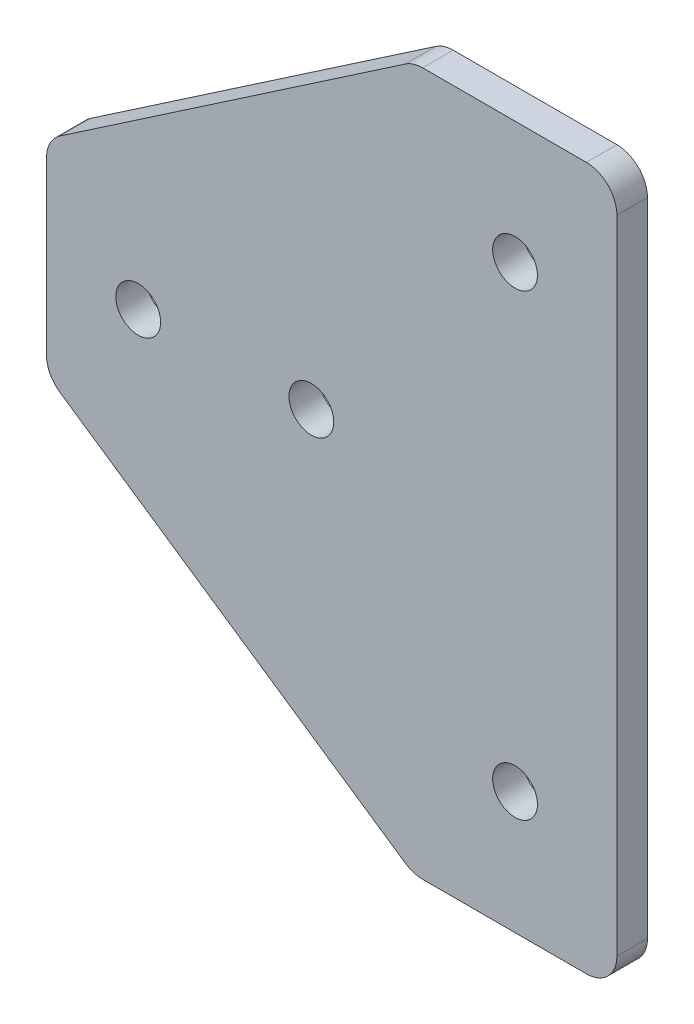
ISO-10303-21;
HEADER;
FILE_DESCRIPTION(('STEP AP214'),'2;1');
FILE_NAME('part.step','',(''),(''),'','','');
FILE_SCHEMA(('AUTOMOTIVE_DESIGN { 1 0 10303 214 1 1 1 1 }'));
ENDSEC;
DATA;
#1=APPLICATION_CONTEXT('core data for automotive mechanical design processes');
#2=APPLICATION_PROTOCOL_DEFINITION('international standard','automotive_design',2000,#1);
#3=PRODUCT_CONTEXT('',#1,'mechanical');
#4=PRODUCT('Part','Part','',(#3));
#5=PRODUCT_RELATED_PRODUCT_CATEGORY('part','',(#4));
#6=PRODUCT_DEFINITION_FORMATION('','',#4);
#7=PRODUCT_DEFINITION_CONTEXT('part definition',#1,'design');
#8=PRODUCT_DEFINITION('design','',#6,#7);
#9=PRODUCT_DEFINITION_SHAPE('','',#8);
#10=(LENGTH_UNIT() NAMED_UNIT(*) SI_UNIT(.MILLI.,.METRE.));
#11=(NAMED_UNIT(*) PLANE_ANGLE_UNIT() SI_UNIT($,.RADIAN.));
#12=(NAMED_UNIT(*) SI_UNIT($,.STERADIAN.) SOLID_ANGLE_UNIT());
#13=UNCERTAINTY_MEASURE_WITH_UNIT(LENGTH_MEASURE(1.E-05),#10,'distance_accuracy_value','');
#14=(GEOMETRIC_REPRESENTATION_CONTEXT(3) GLOBAL_UNCERTAINTY_ASSIGNED_CONTEXT((#13)) GLOBAL_UNIT_ASSIGNED_CONTEXT((#10,
#11,#12)) REPRESENTATION_CONTEXT('',''));
#15=CARTESIAN_POINT('',(0.,0.,0.));
#16=DIRECTION('',(0.,0.,1.));
#17=DIRECTION('',(1.,0.,0.));
#18=AXIS2_PLACEMENT_3D('',#15,#16,#17);
#19=CARTESIAN_POINT('',(-20.,-34.5,3.));
#20=DIRECTION('',(0.,1.,0.));
#21=DIRECTION('',(0.,0.,1.));
#22=AXIS2_PLACEMENT_3D('',#19,#20,#21);
#23=PLANE('',#22);
#24=DIRECTION('',(1.,0.,0.));
#25=VECTOR('',#24,1.);
#26=CARTESIAN_POINT('',(-20.,-34.5,0.));
#27=LINE('',#26,#25);
#28=CARTESIAN_POINT('',(-19.076005786987,-34.5,0.));
#29=VERTEX_POINT('',#28);
#30=CARTESIAN_POINT('',(-3.,-34.5,0.));
#31=VERTEX_POINT('',#30);
#32=EDGE_CURVE('E149',#29,#31,#27,.T.);
#33=ORIENTED_EDGE('',*,*,#32,.T.);
#34=DIRECTION('',(0.,0.,-1.));
#35=VECTOR('',#34,1.);
#36=CARTESIAN_POINT('',(-3.,-34.5,3.));
#37=LINE('',#36,#35);
#38=CARTESIAN_POINT('',(-3.,-34.5,3.));
#39=VERTEX_POINT('',#38);
#40=EDGE_CURVE('E127',#31,#39,#37,.F.);
#41=ORIENTED_EDGE('',*,*,#40,.T.);
#42=DIRECTION('',(1.,0.,0.));
#43=VECTOR('',#42,1.);
#44=CARTESIAN_POINT('',(-20.,-34.5,3.));
#45=LINE('',#44,#43);
#46=CARTESIAN_POINT('',(-19.076005786987,-34.5,3.));
#47=VERTEX_POINT('',#46);
#48=EDGE_CURVE('E165',#47,#39,#45,.T.);
#49=ORIENTED_EDGE('',*,*,#48,.F.);
#50=DIRECTION('',(0.,0.,-1.));
#51=VECTOR('',#50,1.);
#52=CARTESIAN_POINT('',(-19.076005786987,-34.5,3.));
#53=LINE('',#52,#51);
#54=EDGE_CURVE('E132',#47,#29,#53,.T.);
#55=ORIENTED_EDGE('',*,*,#54,.T.);
#56=EDGE_LOOP('',(#33,#41,#49,#55));
#57=FACE_BOUND('',#56,.T.);
#58=ADVANCED_FACE('F32',(#57),#23,.F.);
#59=CARTESIAN_POINT('',(0.,-34.5,3.));
#60=DIRECTION('',(-1.,0.,0.));
#61=DIRECTION('',(0.,0.,1.));
#62=AXIS2_PLACEMENT_3D('',#59,#60,#61);
#63=PLANE('',#62);
#64=DIRECTION('',(0.,1.,0.));
#65=VECTOR('',#64,1.);
#66=CARTESIAN_POINT('',(0.,-34.5,3.));
#67=LINE('',#66,#65);
#68=CARTESIAN_POINT('',(0.,-31.5,3.));
#69=VERTEX_POINT('',#68);
#70=CARTESIAN_POINT('',(0.,31.5,3.));
#71=VERTEX_POINT('',#70);
#72=EDGE_CURVE('E142',#69,#71,#67,.T.);
#73=ORIENTED_EDGE('',*,*,#72,.F.);
#74=DIRECTION('',(0.,0.,-1.));
#75=VECTOR('',#74,1.);
#76=CARTESIAN_POINT('',(0.,-31.5,3.));
#77=LINE('',#76,#75);
#78=CARTESIAN_POINT('',(0.,-31.5,0.));
#79=VERTEX_POINT('',#78);
#80=EDGE_CURVE('E126',#69,#79,#77,.T.);
#81=ORIENTED_EDGE('',*,*,#80,.T.);
#82=DIRECTION('',(0.,1.,0.));
#83=VECTOR('',#82,1.);
#84=CARTESIAN_POINT('',(0.,-34.5,0.));
#85=LINE('',#84,#83);
#86=CARTESIAN_POINT('',(0.,31.5,0.));
#87=VERTEX_POINT('',#86);
#88=EDGE_CURVE('E139',#79,#87,#85,.T.);
#89=ORIENTED_EDGE('',*,*,#88,.T.);
#90=DIRECTION('',(0.,0.,-1.));
#91=VECTOR('',#90,1.);
#92=CARTESIAN_POINT('',(0.,31.5,3.));
#93=LINE('',#92,#91);
#94=EDGE_CURVE('E144',#87,#71,#93,.F.);
#95=ORIENTED_EDGE('',*,*,#94,.T.);
#96=EDGE_LOOP('',(#73,#81,#89,#95));
#97=FACE_BOUND('',#96,.T.);
#98=ADVANCED_FACE('F138',(#97),#63,.F.);
#99=CARTESIAN_POINT('',(0.,34.5,3.));
#100=DIRECTION('',(0.,-1.,0.));
#101=DIRECTION('',(0.,0.,-1.));
#102=AXIS2_PLACEMENT_3D('',#99,#100,#101);
#103=PLANE('',#102);
#104=DIRECTION('',(-1.,0.,0.));
#105=VECTOR('',#104,1.);
#106=CARTESIAN_POINT('',(0.,34.5,0.));
#107=LINE('',#106,#105);
#108=CARTESIAN_POINT('',(-3.,34.5,0.));
#109=VERTEX_POINT('',#108);
#110=CARTESIAN_POINT('',(-19.076005786987,34.5,0.));
#111=VERTEX_POINT('',#110);
#112=EDGE_CURVE('E148',#109,#111,#107,.T.);
#113=ORIENTED_EDGE('',*,*,#112,.T.);
#114=DIRECTION('',(0.,0.,-1.));
#115=VECTOR('',#114,1.);
#116=CARTESIAN_POINT('',(-19.076005786987,34.5,3.));
#117=LINE('',#116,#115);
#118=CARTESIAN_POINT('',(-19.076005786987,34.5,3.));
#119=VERTEX_POINT('',#118);
#120=EDGE_CURVE('E11',#111,#119,#117,.F.);
#121=ORIENTED_EDGE('',*,*,#120,.T.);
#122=DIRECTION('',(-1.,0.,0.));
#123=VECTOR('',#122,1.);
#124=CARTESIAN_POINT('',(0.,34.5,3.));
#125=LINE('',#124,#123);
#126=CARTESIAN_POINT('',(-3.,34.5,3.));
#127=VERTEX_POINT('',#126);
#128=EDGE_CURVE('E210',#127,#119,#125,.T.);
#129=ORIENTED_EDGE('',*,*,#128,.F.);
#130=DIRECTION('',(0.,0.,-1.));
#131=VECTOR('',#130,1.);
#132=CARTESIAN_POINT('',(-3.,34.5,3.));
#133=LINE('',#132,#131);
#134=EDGE_CURVE('E40',#127,#109,#133,.T.);
#135=ORIENTED_EDGE('',*,*,#134,.T.);
#136=EDGE_LOOP('',(#113,#121,#129,#135));
#137=FACE_BOUND('',#136,.T.);
#138=ADVANCED_FACE('F207',(#137),#103,.F.);
#139=CARTESIAN_POINT('',(-20.,34.5,3.));
#140=DIRECTION('',(0.562624043306709,-0.826712879960879,0.));
#141=DIRECTION('',(0.826712879960879,0.562624043306709,0.));
#142=AXIS2_PLACEMENT_3D('',#139,#140,#141);
#143=PLANE('',#142);
#144=DIRECTION('',(-0.826712879960879,-0.562624043306709,0.));
#145=VECTOR('',#144,1.);
#146=CARTESIAN_POINT('',(-20.,34.5,0.));
#147=LINE('',#146,#145);
#148=CARTESIAN_POINT('',(-20.7638779169071,33.9801386398826,0.));
#149=VERTEX_POINT('',#148);
#150=CARTESIAN_POINT('',(-54.6878721299201,10.8929759115822,0.));
#151=VERTEX_POINT('',#150);
#152=EDGE_CURVE('E152',#149,#151,#147,.T.);
#153=ORIENTED_EDGE('',*,*,#152,.T.);
#154=DIRECTION('',(0.,0.,-1.));
#155=VECTOR('',#154,1.);
#156=CARTESIAN_POINT('',(-54.6878721299201,10.8929759115821,3.));
#157=LINE('',#156,#155);
#158=CARTESIAN_POINT('',(-54.6878721299201,10.8929759115822,3.));
#159=VERTEX_POINT('',#158);
#160=EDGE_CURVE('E202',#151,#159,#157,.F.);
#161=ORIENTED_EDGE('',*,*,#160,.T.);
#162=DIRECTION('',(-0.826712879960879,-0.562624043306709,0.));
#163=VECTOR('',#162,1.);
#164=CARTESIAN_POINT('',(-20.,34.5,3.));
#165=LINE('',#164,#163);
#166=CARTESIAN_POINT('',(-20.7638779169071,33.9801386398826,3.));
#167=VERTEX_POINT('',#166);
#168=EDGE_CURVE('E223',#167,#159,#165,.T.);
#169=ORIENTED_EDGE('',*,*,#168,.F.);
#170=DIRECTION('',(0.,0.,-1.));
#171=VECTOR('',#170,1.);
#172=CARTESIAN_POINT('',(-20.7638779169071,33.9801386398826,3.));
#173=LINE('',#172,#171);
#174=EDGE_CURVE('E199',#167,#149,#173,.T.);
#175=ORIENTED_EDGE('',*,*,#174,.T.);
#176=EDGE_LOOP('',(#153,#161,#169,#175));
#177=FACE_BOUND('',#176,.T.);
#178=ADVANCED_FACE('F220',(#177),#143,.F.);
#179=CARTESIAN_POINT('',(-56.,10.,3.));
#180=DIRECTION('',(1.,0.,0.));
#181=DIRECTION('',(0.,0.,-1.));
#182=AXIS2_PLACEMENT_3D('',#179,#180,#181);
#183=PLANE('',#182);
#184=DIRECTION('',(0.,-1.,0.));
#185=VECTOR('',#184,1.);
#186=CARTESIAN_POINT('',(-56.,10.,0.));
#187=LINE('',#186,#185);
#188=CARTESIAN_POINT('',(-56.,8.4128372716995,0.));
#189=VERTEX_POINT('',#188);
#190=CARTESIAN_POINT('',(-56.,-8.4128372716995,0.));
#191=VERTEX_POINT('',#190);
#192=EDGE_CURVE('E160',#189,#191,#187,.T.);
#193=ORIENTED_EDGE('',*,*,#192,.T.);
#194=DIRECTION('',(0.,0.,-1.));
#195=VECTOR('',#194,1.);
#196=CARTESIAN_POINT('',(-56.,-8.4128372716995,3.));
#197=LINE('',#196,#195);
#198=CARTESIAN_POINT('',(-56.,-8.4128372716995,3.));
#199=VERTEX_POINT('',#198);
#200=EDGE_CURVE('E197',#191,#199,#197,.F.);
#201=ORIENTED_EDGE('',*,*,#200,.T.);
#202=DIRECTION('',(0.,-1.,0.));
#203=VECTOR('',#202,1.);
#204=CARTESIAN_POINT('',(-56.,10.,3.));
#205=LINE('',#204,#203);
#206=CARTESIAN_POINT('',(-56.,8.4128372716995,3.));
#207=VERTEX_POINT('',#206);
#208=EDGE_CURVE('E225',#207,#199,#205,.T.);
#209=ORIENTED_EDGE('',*,*,#208,.F.);
#210=DIRECTION('',(0.,0.,-1.));
#211=VECTOR('',#210,1.);
#212=CARTESIAN_POINT('',(-56.,8.4128372716995,3.));
#213=LINE('',#212,#211);
#214=EDGE_CURVE('E194',#207,#189,#213,.T.);
#215=ORIENTED_EDGE('',*,*,#214,.T.);
#216=EDGE_LOOP('',(#193,#201,#209,#215));
#217=FACE_BOUND('',#216,.T.);
#218=ADVANCED_FACE('F246',(#217),#183,.F.);
#219=CARTESIAN_POINT('',(-56.,-10.,3.));
#220=DIRECTION('',(0.562624043306709,0.826712879960879,0.));
#221=DIRECTION('',(-0.826712879960879,0.562624043306709,0.));
#222=AXIS2_PLACEMENT_3D('',#219,#220,#221);
#223=PLANE('',#222);
#224=DIRECTION('',(0.826712879960879,-0.562624043306709,0.));
#225=VECTOR('',#224,1.);
#226=CARTESIAN_POINT('',(-56.,-10.,0.));
#227=LINE('',#226,#225);
#228=CARTESIAN_POINT('',(-54.6878721299201,-10.8929759115821,0.));
#229=VERTEX_POINT('',#228);
#230=CARTESIAN_POINT('',(-20.7638779169072,-33.9801386398826,0.));
#231=VERTEX_POINT('',#230);
#232=EDGE_CURVE('E163',#229,#231,#227,.T.);
#233=ORIENTED_EDGE('',*,*,#232,.T.);
#234=DIRECTION('',(0.,0.,-1.));
#235=VECTOR('',#234,1.);
#236=CARTESIAN_POINT('',(-20.7638779169071,-33.9801386398826,3.));
#237=LINE('',#236,#235);
#238=CARTESIAN_POINT('',(-20.7638779169072,-33.9801386398826,3.));
#239=VERTEX_POINT('',#238);
#240=EDGE_CURVE('E47',#231,#239,#237,.F.);
#241=ORIENTED_EDGE('',*,*,#240,.T.);
#242=DIRECTION('',(0.826712879960879,-0.562624043306709,0.));
#243=VECTOR('',#242,1.);
#244=CARTESIAN_POINT('',(-56.,-10.,3.));
#245=LINE('',#244,#243);
#246=CARTESIAN_POINT('',(-54.6878721299201,-10.8929759115821,3.));
#247=VERTEX_POINT('',#246);
#248=EDGE_CURVE('E166',#247,#239,#245,.T.);
#249=ORIENTED_EDGE('',*,*,#248,.F.);
#250=DIRECTION('',(0.,0.,-1.));
#251=VECTOR('',#250,1.);
#252=CARTESIAN_POINT('',(-54.6878721299201,-10.8929759115821,3.));
#253=LINE('',#252,#251);
#254=EDGE_CURVE('E190',#247,#229,#253,.T.);
#255=ORIENTED_EDGE('',*,*,#254,.T.);
#256=EDGE_LOOP('',(#233,#241,#249,#255));
#257=FACE_BOUND('',#256,.T.);
#258=ADVANCED_FACE('F240',(#257),#223,.F.);
#259=CARTESIAN_POINT('',(0.,0.,3.));
#260=DIRECTION('',(0.,0.,1.));
#261=DIRECTION('',(1.,0.,0.));
#262=AXIS2_PLACEMENT_3D('',#259,#260,#261);
#263=PLANE('',#262);
#264=CARTESIAN_POINT('',(-10.,-22.5,3.));
#265=DIRECTION('',(0.,0.,1.));
#266=DIRECTION('',(1.,0.,0.));
#267=AXIS2_PLACEMENT_3D('',#264,#265,#266);
#268=CIRCLE('',#267,2.2);
#269=CARTESIAN_POINT('',(-7.8,-22.5,3.));
#270=VERTEX_POINT('',#269);
#271=EDGE_CURVE('E320',#270,#270,#268,.T.);
#272=ORIENTED_EDGE('',*,*,#271,.F.);
#273=EDGE_LOOP('',(#272));
#274=FACE_BOUND('',#273,.T.);
#275=CARTESIAN_POINT('',(-10.,22.5,3.));
#276=DIRECTION('',(0.,0.,1.));
#277=DIRECTION('',(1.,0.,0.));
#278=AXIS2_PLACEMENT_3D('',#275,#276,#277);
#279=CIRCLE('',#278,2.2);
#280=CARTESIAN_POINT('',(-7.8,22.5,3.));
#281=VERTEX_POINT('',#280);
#282=EDGE_CURVE('E314',#281,#281,#279,.T.);
#283=ORIENTED_EDGE('',*,*,#282,.F.);
#284=EDGE_LOOP('',(#283));
#285=FACE_BOUND('',#284,.T.);
#286=CARTESIAN_POINT('',(-30.,0.,3.));
#287=DIRECTION('',(0.,0.,1.));
#288=DIRECTION('',(1.,0.,0.));
#289=AXIS2_PLACEMENT_3D('',#286,#287,#288);
#290=CIRCLE('',#289,2.2);
#291=CARTESIAN_POINT('',(-27.8,0.,3.));
#292=VERTEX_POINT('',#291);
#293=EDGE_CURVE('E308',#292,#292,#290,.T.);
#294=ORIENTED_EDGE('',*,*,#293,.F.);
#295=EDGE_LOOP('',(#294));
#296=FACE_BOUND('',#295,.T.);
#297=CARTESIAN_POINT('',(-47.,0.,3.));
#298=DIRECTION('',(0.,0.,1.));
#299=DIRECTION('',(1.,0.,0.));
#300=AXIS2_PLACEMENT_3D('',#297,#298,#299);
#301=CIRCLE('',#300,2.2);
#302=CARTESIAN_POINT('',(-44.8,0.,3.));
#303=VERTEX_POINT('',#302);
#304=EDGE_CURVE('E302',#303,#303,#301,.T.);
#305=ORIENTED_EDGE('',*,*,#304,.F.);
#306=EDGE_LOOP('',(#305));
#307=FACE_BOUND('',#306,.T.);
#308=ORIENTED_EDGE('',*,*,#48,.T.);
#309=CARTESIAN_POINT('',(-3.,-31.5,3.));
#310=DIRECTION('',(0.,0.,1.));
#311=DIRECTION('',(1.,0.,0.));
#312=AXIS2_PLACEMENT_3D('',#309,#310,#311);
#313=CIRCLE('',#312,3.);
#314=EDGE_CURVE('E188',#39,#69,#313,.T.);
#315=ORIENTED_EDGE('',*,*,#314,.T.);
#316=ORIENTED_EDGE('',*,*,#72,.T.);
#317=CARTESIAN_POINT('',(-3.,31.5,3.));
#318=DIRECTION('',(0.,0.,1.));
#319=DIRECTION('',(1.,0.,0.));
#320=AXIS2_PLACEMENT_3D('',#317,#318,#319);
#321=CIRCLE('',#320,3.);
#322=EDGE_CURVE('E179',#71,#127,#321,.T.);
#323=ORIENTED_EDGE('',*,*,#322,.T.);
#324=ORIENTED_EDGE('',*,*,#128,.T.);
#325=CARTESIAN_POINT('',(-19.076005786987,31.5,3.));
#326=DIRECTION('',(0.,0.,1.));
#327=DIRECTION('',(1.,0.,0.));
#328=AXIS2_PLACEMENT_3D('',#325,#326,#327);
#329=CIRCLE('',#328,3.);
#330=EDGE_CURVE('E181',#119,#167,#329,.T.);
#331=ORIENTED_EDGE('',*,*,#330,.T.);
#332=ORIENTED_EDGE('',*,*,#168,.T.);
#333=CARTESIAN_POINT('',(-53.,8.4128372716995,3.));
#334=DIRECTION('',(0.,0.,1.));
#335=DIRECTION('',(1.,0.,0.));
#336=AXIS2_PLACEMENT_3D('',#333,#334,#335);
#337=CIRCLE('',#336,3.);
#338=EDGE_CURVE('E183',#159,#207,#337,.T.);
#339=ORIENTED_EDGE('',*,*,#338,.T.);
#340=ORIENTED_EDGE('',*,*,#208,.T.);
#341=CARTESIAN_POINT('',(-53.,-8.4128372716995,3.));
#342=DIRECTION('',(0.,0.,1.));
#343=DIRECTION('',(1.,0.,0.));
#344=AXIS2_PLACEMENT_3D('',#341,#342,#343);
#345=CIRCLE('',#344,3.);
#346=EDGE_CURVE('E54',#199,#247,#345,.T.);
#347=ORIENTED_EDGE('',*,*,#346,.T.);
#348=ORIENTED_EDGE('',*,*,#248,.T.);
#349=CARTESIAN_POINT('',(-19.076005786987,-31.5,3.));
#350=DIRECTION('',(0.,0.,1.));
#351=DIRECTION('',(1.,0.,0.));
#352=AXIS2_PLACEMENT_3D('',#349,#350,#351);
#353=CIRCLE('',#352,3.);
#354=EDGE_CURVE('E186',#239,#47,#353,.T.);
#355=ORIENTED_EDGE('',*,*,#354,.T.);
#356=EDGE_LOOP('',(#308,#315,#316,#323,#324,#331,#332,#339,#340,#347,#348,#355));
#357=FACE_BOUND('',#356,.T.);
#358=ADVANCED_FACE('F232',(#274,#285,#296,#307,#357),#263,.T.);
#359=CARTESIAN_POINT('',(0.,0.,0.));
#360=DIRECTION('',(0.,0.,1.));
#361=DIRECTION('',(1.,0.,0.));
#362=AXIS2_PLACEMENT_3D('',#359,#360,#361);
#363=PLANE('',#362);
#364=CARTESIAN_POINT('',(-10.,-22.5,0.));
#365=DIRECTION('',(0.,0.,1.));
#366=DIRECTION('',(1.,0.,0.));
#367=AXIS2_PLACEMENT_3D('',#364,#365,#366);
#368=CIRCLE('',#367,2.2);
#369=CARTESIAN_POINT('',(-7.8,-22.5,0.));
#370=VERTEX_POINT('',#369);
#371=EDGE_CURVE('E317',#370,#370,#368,.T.);
#372=ORIENTED_EDGE('',*,*,#371,.T.);
#373=EDGE_LOOP('',(#372));
#374=FACE_BOUND('',#373,.T.);
#375=CARTESIAN_POINT('',(-10.,22.5,0.));
#376=DIRECTION('',(0.,0.,1.));
#377=DIRECTION('',(1.,0.,0.));
#378=AXIS2_PLACEMENT_3D('',#375,#376,#377);
#379=CIRCLE('',#378,2.2);
#380=CARTESIAN_POINT('',(-7.8,22.5,0.));
#381=VERTEX_POINT('',#380);
#382=EDGE_CURVE('E311',#381,#381,#379,.T.);
#383=ORIENTED_EDGE('',*,*,#382,.T.);
#384=EDGE_LOOP('',(#383));
#385=FACE_BOUND('',#384,.T.);
#386=CARTESIAN_POINT('',(-30.,0.,0.));
#387=DIRECTION('',(0.,0.,1.));
#388=DIRECTION('',(1.,0.,0.));
#389=AXIS2_PLACEMENT_3D('',#386,#387,#388);
#390=CIRCLE('',#389,2.2);
#391=CARTESIAN_POINT('',(-27.8,0.,0.));
#392=VERTEX_POINT('',#391);
#393=EDGE_CURVE('E305',#392,#392,#390,.T.);
#394=ORIENTED_EDGE('',*,*,#393,.T.);
#395=EDGE_LOOP('',(#394));
#396=FACE_BOUND('',#395,.T.);
#397=CARTESIAN_POINT('',(-47.,0.,0.));
#398=DIRECTION('',(0.,0.,1.));
#399=DIRECTION('',(1.,0.,0.));
#400=AXIS2_PLACEMENT_3D('',#397,#398,#399);
#401=CIRCLE('',#400,2.2);
#402=CARTESIAN_POINT('',(-44.8,0.,0.));
#403=VERTEX_POINT('',#402);
#404=EDGE_CURVE('E154',#403,#403,#401,.T.);
#405=ORIENTED_EDGE('',*,*,#404,.T.);
#406=EDGE_LOOP('',(#405));
#407=FACE_BOUND('',#406,.T.);
#408=ORIENTED_EDGE('',*,*,#88,.F.);
#409=CARTESIAN_POINT('',(-3.,-31.5,0.));
#410=DIRECTION('',(0.,0.,1.));
#411=DIRECTION('',(1.,0.,0.));
#412=AXIS2_PLACEMENT_3D('',#409,#410,#411);
#413=CIRCLE('',#412,3.);
#414=EDGE_CURVE('E122',#79,#31,#413,.F.);
#415=ORIENTED_EDGE('',*,*,#414,.T.);
#416=ORIENTED_EDGE('',*,*,#32,.F.);
#417=CARTESIAN_POINT('',(-19.076005786987,-31.5,0.));
#418=DIRECTION('',(0.,0.,1.));
#419=DIRECTION('',(1.,0.,0.));
#420=AXIS2_PLACEMENT_3D('',#417,#418,#419);
#421=CIRCLE('',#420,3.);
#422=EDGE_CURVE('E133',#29,#231,#421,.F.);
#423=ORIENTED_EDGE('',*,*,#422,.T.);
#424=ORIENTED_EDGE('',*,*,#232,.F.);
#425=CARTESIAN_POINT('',(-53.,-8.4128372716995,0.));
#426=DIRECTION('',(0.,0.,1.));
#427=DIRECTION('',(1.,0.,0.));
#428=AXIS2_PLACEMENT_3D('',#425,#426,#427);
#429=CIRCLE('',#428,3.);
#430=EDGE_CURVE('E173',#229,#191,#429,.F.);
#431=ORIENTED_EDGE('',*,*,#430,.T.);
#432=ORIENTED_EDGE('',*,*,#192,.F.);
#433=CARTESIAN_POINT('',(-53.,8.4128372716995,0.));
#434=DIRECTION('',(0.,0.,1.));
#435=DIRECTION('',(1.,0.,0.));
#436=AXIS2_PLACEMENT_3D('',#433,#434,#435);
#437=CIRCLE('',#436,3.);
#438=EDGE_CURVE('E171',#189,#151,#437,.F.);
#439=ORIENTED_EDGE('',*,*,#438,.T.);
#440=ORIENTED_EDGE('',*,*,#152,.F.);
#441=CARTESIAN_POINT('',(-19.076005786987,31.5,0.));
#442=DIRECTION('',(0.,0.,1.));
#443=DIRECTION('',(1.,0.,0.));
#444=AXIS2_PLACEMENT_3D('',#441,#442,#443);
#445=CIRCLE('',#444,3.);
#446=EDGE_CURVE('E169',#149,#111,#445,.F.);
#447=ORIENTED_EDGE('',*,*,#446,.T.);
#448=ORIENTED_EDGE('',*,*,#112,.F.);
#449=CARTESIAN_POINT('',(-3.,31.5,0.));
#450=DIRECTION('',(0.,0.,1.));
#451=DIRECTION('',(1.,0.,0.));
#452=AXIS2_PLACEMENT_3D('',#449,#450,#451);
#453=CIRCLE('',#452,3.);
#454=EDGE_CURVE('E143',#109,#87,#453,.F.);
#455=ORIENTED_EDGE('',*,*,#454,.T.);
#456=EDGE_LOOP('',(#408,#415,#416,#423,#424,#431,#432,#439,#440,#447,#448,#455));
#457=FACE_BOUND('',#456,.T.);
#458=ADVANCED_FACE('F146',(#374,#385,#396,#407,#457),#363,.F.);
#459=CARTESIAN_POINT('',(-47.,0.,0.));
#460=DIRECTION('',(0.,0.,1.));
#461=DIRECTION('',(1.,0.,0.));
#462=AXIS2_PLACEMENT_3D('',#459,#460,#461);
#463=CYLINDRICAL_SURFACE('',#462,2.2);
#464=ORIENTED_EDGE('',*,*,#404,.F.);
#465=EDGE_LOOP('',(#464));
#466=FACE_BOUND('',#465,.T.);
#467=ORIENTED_EDGE('',*,*,#304,.T.);
#468=EDGE_LOOP('',(#467));
#469=FACE_BOUND('',#468,.T.);
#470=ADVANCED_FACE('F342',(#466,#469),#463,.F.);
#471=CARTESIAN_POINT('',(-30.,0.,0.));
#472=DIRECTION('',(0.,0.,1.));
#473=DIRECTION('',(1.,0.,0.));
#474=AXIS2_PLACEMENT_3D('',#471,#472,#473);
#475=CYLINDRICAL_SURFACE('',#474,2.2);
#476=ORIENTED_EDGE('',*,*,#393,.F.);
#477=EDGE_LOOP('',(#476));
#478=FACE_BOUND('',#477,.T.);
#479=ORIENTED_EDGE('',*,*,#293,.T.);
#480=EDGE_LOOP('',(#479));
#481=FACE_BOUND('',#480,.T.);
#482=ADVANCED_FACE('F344',(#478,#481),#475,.F.);
#483=CARTESIAN_POINT('',(-10.,22.5,0.));
#484=DIRECTION('',(0.,0.,1.));
#485=DIRECTION('',(1.,0.,0.));
#486=AXIS2_PLACEMENT_3D('',#483,#484,#485);
#487=CYLINDRICAL_SURFACE('',#486,2.2);
#488=ORIENTED_EDGE('',*,*,#382,.F.);
#489=EDGE_LOOP('',(#488));
#490=FACE_BOUND('',#489,.T.);
#491=ORIENTED_EDGE('',*,*,#282,.T.);
#492=EDGE_LOOP('',(#491));
#493=FACE_BOUND('',#492,.T.);
#494=ADVANCED_FACE('F329',(#490,#493),#487,.F.);
#495=CARTESIAN_POINT('',(-10.,-22.5,0.));
#496=DIRECTION('',(0.,0.,1.));
#497=DIRECTION('',(1.,0.,0.));
#498=AXIS2_PLACEMENT_3D('',#495,#496,#497);
#499=CYLINDRICAL_SURFACE('',#498,2.2);
#500=ORIENTED_EDGE('',*,*,#371,.F.);
#501=EDGE_LOOP('',(#500));
#502=FACE_BOUND('',#501,.T.);
#503=ORIENTED_EDGE('',*,*,#271,.T.);
#504=EDGE_LOOP('',(#503));
#505=FACE_BOUND('',#504,.T.);
#506=ADVANCED_FACE('F268',(#502,#505),#499,.F.);
#507=CARTESIAN_POINT('',(-3.,-31.5,3.));
#508=DIRECTION('',(0.,0.,-1.));
#509=DIRECTION('',(-1.,0.,0.));
#510=AXIS2_PLACEMENT_3D('',#507,#508,#509);
#511=CYLINDRICAL_SURFACE('',#510,3.);
#512=ORIENTED_EDGE('',*,*,#314,.F.);
#513=ORIENTED_EDGE('',*,*,#40,.F.);
#514=ORIENTED_EDGE('',*,*,#414,.F.);
#515=ORIENTED_EDGE('',*,*,#80,.F.);
#516=EDGE_LOOP('',(#512,#513,#514,#515));
#517=FACE_BOUND('',#516,.T.);
#518=ADVANCED_FACE('F125',(#517),#511,.T.);
#519=CARTESIAN_POINT('',(-19.076005786987,-31.5,3.));
#520=DIRECTION('',(0.,0.,-1.));
#521=DIRECTION('',(-1.,0.,0.));
#522=AXIS2_PLACEMENT_3D('',#519,#520,#521);
#523=CYLINDRICAL_SURFACE('',#522,3.);
#524=ORIENTED_EDGE('',*,*,#354,.F.);
#525=ORIENTED_EDGE('',*,*,#240,.F.);
#526=ORIENTED_EDGE('',*,*,#422,.F.);
#527=ORIENTED_EDGE('',*,*,#54,.F.);
#528=EDGE_LOOP('',(#524,#525,#526,#527));
#529=FACE_BOUND('',#528,.T.);
#530=ADVANCED_FACE('F237',(#529),#523,.T.);
#531=CARTESIAN_POINT('',(-53.,-8.4128372716995,3.));
#532=DIRECTION('',(0.,0.,-1.));
#533=DIRECTION('',(-1.,0.,0.));
#534=AXIS2_PLACEMENT_3D('',#531,#532,#533);
#535=CYLINDRICAL_SURFACE('',#534,3.);
#536=ORIENTED_EDGE('',*,*,#346,.F.);
#537=ORIENTED_EDGE('',*,*,#200,.F.);
#538=ORIENTED_EDGE('',*,*,#430,.F.);
#539=ORIENTED_EDGE('',*,*,#254,.F.);
#540=EDGE_LOOP('',(#536,#537,#538,#539));
#541=FACE_BOUND('',#540,.T.);
#542=ADVANCED_FACE('F242',(#541),#535,.T.);
#543=CARTESIAN_POINT('',(-53.,8.4128372716995,3.));
#544=DIRECTION('',(0.,0.,-1.));
#545=DIRECTION('',(-1.,0.,0.));
#546=AXIS2_PLACEMENT_3D('',#543,#544,#545);
#547=CYLINDRICAL_SURFACE('',#546,3.);
#548=ORIENTED_EDGE('',*,*,#338,.F.);
#549=ORIENTED_EDGE('',*,*,#160,.F.);
#550=ORIENTED_EDGE('',*,*,#438,.F.);
#551=ORIENTED_EDGE('',*,*,#214,.F.);
#552=EDGE_LOOP('',(#548,#549,#550,#551));
#553=FACE_BOUND('',#552,.T.);
#554=ADVANCED_FACE('F250',(#553),#547,.T.);
#555=CARTESIAN_POINT('',(-19.076005786987,31.5,3.));
#556=DIRECTION('',(0.,0.,-1.));
#557=DIRECTION('',(-1.,0.,0.));
#558=AXIS2_PLACEMENT_3D('',#555,#556,#557);
#559=CYLINDRICAL_SURFACE('',#558,3.);
#560=ORIENTED_EDGE('',*,*,#330,.F.);
#561=ORIENTED_EDGE('',*,*,#120,.F.);
#562=ORIENTED_EDGE('',*,*,#446,.F.);
#563=ORIENTED_EDGE('',*,*,#174,.F.);
#564=EDGE_LOOP('',(#560,#561,#562,#563));
#565=FACE_BOUND('',#564,.T.);
#566=ADVANCED_FACE('F217',(#565),#559,.T.);
#567=CARTESIAN_POINT('',(-3.,31.5,3.));
#568=DIRECTION('',(0.,0.,-1.));
#569=DIRECTION('',(-1.,0.,0.));
#570=AXIS2_PLACEMENT_3D('',#567,#568,#569);
#571=CYLINDRICAL_SURFACE('',#570,3.);
#572=ORIENTED_EDGE('',*,*,#322,.F.);
#573=ORIENTED_EDGE('',*,*,#94,.F.);
#574=ORIENTED_EDGE('',*,*,#454,.F.);
#575=ORIENTED_EDGE('',*,*,#134,.F.);
#576=EDGE_LOOP('',(#572,#573,#574,#575));
#577=FACE_BOUND('',#576,.T.);
#578=ADVANCED_FACE('F34',(#577),#571,.T.);
#579=CLOSED_SHELL('',(#58,#98,#138,#178,#218,#258,#358,#458,#470,#482,#494,#506,#518,#530,#542,
#554,#566,#578));
#580=MANIFOLD_SOLID_BREP('B2',#579);
#581=ADVANCED_BREP_SHAPE_REPRESENTATION('',(#18,#580),#14);
#582=SHAPE_DEFINITION_REPRESENTATION(#9,#581);
ENDSEC;
END-ISO-10303-21;
